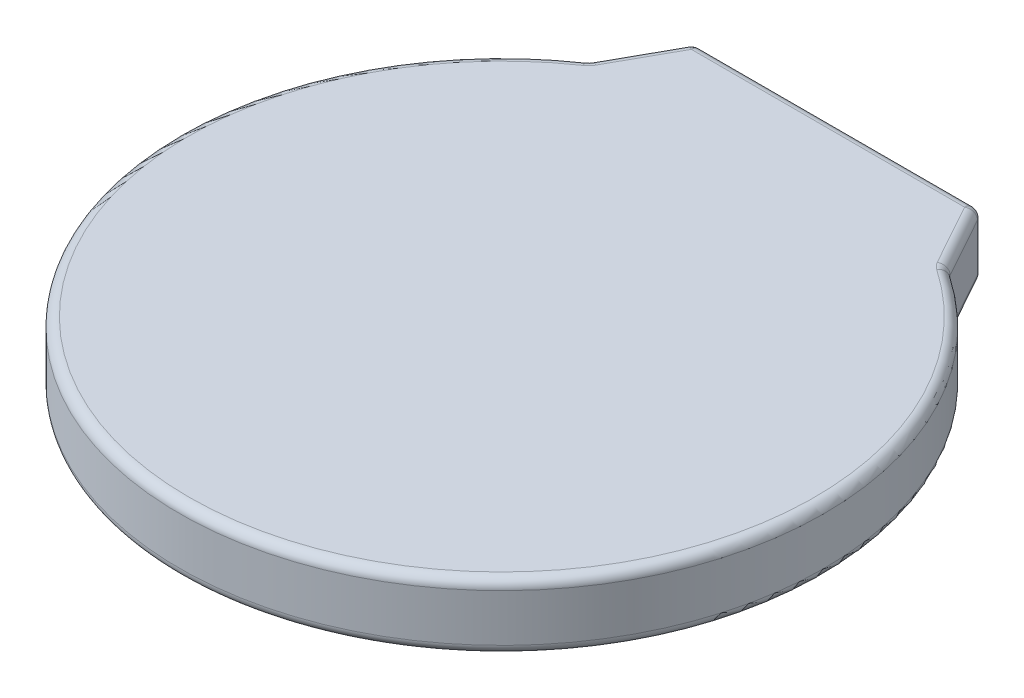
ISO-10303-21;
HEADER;
FILE_DESCRIPTION(('STEP AP214'),'2;1');
FILE_NAME('part.step','',(''),(''),'','','');
FILE_SCHEMA(('AUTOMOTIVE_DESIGN { 1 0 10303 214 1 1 1 1 }'));
ENDSEC;
DATA;
#1=APPLICATION_CONTEXT('core data for automotive mechanical design processes');
#2=APPLICATION_PROTOCOL_DEFINITION('international standard','automotive_design',2000,#1);
#3=PRODUCT_CONTEXT('',#1,'mechanical');
#4=PRODUCT('Part','Part','',(#3));
#5=PRODUCT_RELATED_PRODUCT_CATEGORY('part','',(#4));
#6=PRODUCT_DEFINITION_FORMATION('','',#4);
#7=PRODUCT_DEFINITION_CONTEXT('part definition',#1,'design');
#8=PRODUCT_DEFINITION('design','',#6,#7);
#9=PRODUCT_DEFINITION_SHAPE('','',#8);
#10=(LENGTH_UNIT() NAMED_UNIT(*) SI_UNIT(.MILLI.,.METRE.));
#11=(NAMED_UNIT(*) PLANE_ANGLE_UNIT() SI_UNIT($,.RADIAN.));
#12=(NAMED_UNIT(*) SI_UNIT($,.STERADIAN.) SOLID_ANGLE_UNIT());
#13=UNCERTAINTY_MEASURE_WITH_UNIT(LENGTH_MEASURE(1.E-05),#10,'distance_accuracy_value','');
#14=(GEOMETRIC_REPRESENTATION_CONTEXT(3) GLOBAL_UNCERTAINTY_ASSIGNED_CONTEXT((#13)) GLOBAL_UNIT_ASSIGNED_CONTEXT((#10,
#11,#12)) REPRESENTATION_CONTEXT('',''));
#15=CARTESIAN_POINT('',(0.,0.,0.));
#16=DIRECTION('',(0.,0.,1.));
#17=DIRECTION('',(1.,0.,0.));
#18=AXIS2_PLACEMENT_3D('',#15,#16,#17);
#19=CARTESIAN_POINT('',(0.,3.5,0.));
#20=DIRECTION('',(0.,-1.,0.));
#21=DIRECTION('',(0.,0.,-1.));
#22=AXIS2_PLACEMENT_3D('',#19,#20,#21);
#23=CYLINDRICAL_SURFACE('',#22,17.);
#24=CARTESIAN_POINT('',(0.,3.,0.));
#25=DIRECTION('',(0.,1.,0.));
#26=DIRECTION('',(0.,0.,1.));
#27=AXIS2_PLACEMENT_3D('',#24,#25,#26);
#28=CIRCLE('',#27,17.);
#29=CARTESIAN_POINT('',(9.59708137895813,3.,-14.0319645454817));
#30=VERTEX_POINT('',#29);
#31=CARTESIAN_POINT('',(-9.59708137895813,3.,-14.0319645454817));
#32=VERTEX_POINT('',#31);
#33=EDGE_CURVE('E42',#30,#32,#28,.F.);
#34=ORIENTED_EDGE('',*,*,#33,.T.);
#35=DIRECTION('',(0.,-1.,0.));
#36=VECTOR('',#35,1.);
#37=CARTESIAN_POINT('',(-9.59708137895813,3.5,-14.0319645454817));
#38=LINE('',#37,#36);
#39=CARTESIAN_POINT('',(-9.59708137895813,0.5,-14.0319645454817));
#40=VERTEX_POINT('',#39);
#41=EDGE_CURVE('E11',#32,#40,#38,.T.);
#42=ORIENTED_EDGE('',*,*,#41,.T.);
#43=CARTESIAN_POINT('',(0.,0.5,0.));
#44=DIRECTION('',(0.,1.,0.));
#45=DIRECTION('',(0.,0.,1.));
#46=AXIS2_PLACEMENT_3D('',#43,#44,#45);
#47=CIRCLE('',#46,17.);
#48=CARTESIAN_POINT('',(9.59708137895813,0.5,-14.0319645454817));
#49=VERTEX_POINT('',#48);
#50=EDGE_CURVE('E221',#40,#49,#47,.T.);
#51=ORIENTED_EDGE('',*,*,#50,.T.);
#52=DIRECTION('',(0.,-1.,0.));
#53=VECTOR('',#52,1.);
#54=CARTESIAN_POINT('',(9.59708137895813,3.5,-14.0319645454817));
#55=LINE('',#54,#53);
#56=EDGE_CURVE('E53',#49,#30,#55,.F.);
#57=ORIENTED_EDGE('',*,*,#56,.T.);
#58=EDGE_LOOP('',(#34,#42,#51,#57));
#59=FACE_BOUND('',#58,.T.);
#60=ADVANCED_FACE('F33',(#59),#23,.T.);
#61=CARTESIAN_POINT('',(13.2445336566168,3.5,-7.35372775091861));
#62=DIRECTION('',(0.87427905219483,0.,-0.485423669481937));
#63=DIRECTION('',(-0.485423669481937,0.,-0.87427905219483));
#64=AXIS2_PLACEMENT_3D('',#61,#62,#63);
#65=PLANE('',#64);
#66=DIRECTION('',(0.485423669481937,0.,0.87427905219483));
#67=VECTOR('',#66,1.);
#68=CARTESIAN_POINT('',(7.5,0.5,-17.7));
#69=LINE('',#68,#67);
#70=CARTESIAN_POINT('',(9.44220895224183,0.5,-14.2019575503137));
#71=VERTEX_POINT('',#70);
#72=CARTESIAN_POINT('',(7.64285343447356,0.5,-17.442711834741));
#73=VERTEX_POINT('',#72);
#74=EDGE_CURVE('E306',#71,#73,#69,.F.);
#75=ORIENTED_EDGE('',*,*,#74,.T.);
#76=DIRECTION('',(0.,-1.,0.));
#77=VECTOR('',#76,1.);
#78=CARTESIAN_POINT('',(7.64285343447355,3.5,-17.442711834741));
#79=LINE('',#78,#77);
#80=CARTESIAN_POINT('',(7.64285343447356,3.,-17.442711834741));
#81=VERTEX_POINT('',#80);
#82=EDGE_CURVE('E210',#73,#81,#79,.F.);
#83=ORIENTED_EDGE('',*,*,#82,.T.);
#84=DIRECTION('',(0.485423669481937,0.,0.87427905219483));
#85=VECTOR('',#84,1.);
#86=CARTESIAN_POINT('',(13.2445336566168,3.,-7.35372775091861));
#87=LINE('',#86,#85);
#88=CARTESIAN_POINT('',(9.44220895224183,3.,-14.2019575503137));
#89=VERTEX_POINT('',#88);
#90=EDGE_CURVE('E214',#81,#89,#87,.T.);
#91=ORIENTED_EDGE('',*,*,#90,.T.);
#92=DIRECTION('',(0.,-1.,0.));
#93=VECTOR('',#92,1.);
#94=CARTESIAN_POINT('',(9.44220895224183,3.5,-14.2019575503137));
#95=LINE('',#94,#93);
#96=EDGE_CURVE('E304',#89,#71,#95,.T.);
#97=ORIENTED_EDGE('',*,*,#96,.T.);
#98=EDGE_LOOP('',(#75,#83,#91,#97));
#99=FACE_BOUND('',#98,.T.);
#100=ADVANCED_FACE('F309',(#99),#65,.T.);
#101=CARTESIAN_POINT('',(0.,3.5,-17.7));
#102=DIRECTION('',(0.,0.,-1.));
#103=DIRECTION('',(-1.,0.,0.));
#104=AXIS2_PLACEMENT_3D('',#101,#102,#103);
#105=PLANE('',#104);
#106=DIRECTION('',(1.,0.,0.));
#107=VECTOR('',#106,1.);
#108=CARTESIAN_POINT('',(0.,3.,-17.7));
#109=LINE('',#108,#107);
#110=CARTESIAN_POINT('',(-7.20571390837614,3.,-17.7));
#111=VERTEX_POINT('',#110);
#112=CARTESIAN_POINT('',(7.20571390837614,3.,-17.7));
#113=VERTEX_POINT('',#112);
#114=EDGE_CURVE('E212',#111,#113,#109,.T.);
#115=ORIENTED_EDGE('',*,*,#114,.T.);
#116=DIRECTION('',(0.,-1.,0.));
#117=VECTOR('',#116,1.);
#118=CARTESIAN_POINT('',(7.20571390837614,3.5,-17.7));
#119=LINE('',#118,#117);
#120=CARTESIAN_POINT('',(7.20571390837614,0.5,-17.7));
#121=VERTEX_POINT('',#120);
#122=EDGE_CURVE('E219',#113,#121,#119,.T.);
#123=ORIENTED_EDGE('',*,*,#122,.T.);
#124=DIRECTION('',(1.,0.,0.));
#125=VECTOR('',#124,1.);
#126=CARTESIAN_POINT('',(-7.5,0.5,-17.7));
#127=LINE('',#126,#125);
#128=CARTESIAN_POINT('',(-7.20571390837614,0.5,-17.7));
#129=VERTEX_POINT('',#128);
#130=EDGE_CURVE('E205',#121,#129,#127,.F.);
#131=ORIENTED_EDGE('',*,*,#130,.T.);
#132=DIRECTION('',(0.,-1.,0.));
#133=VECTOR('',#132,1.);
#134=CARTESIAN_POINT('',(-7.20571390837614,3.5,-17.7));
#135=LINE('',#134,#133);
#136=EDGE_CURVE('E209',#129,#111,#135,.F.);
#137=ORIENTED_EDGE('',*,*,#136,.T.);
#138=EDGE_LOOP('',(#115,#123,#131,#137));
#139=FACE_BOUND('',#138,.T.);
#140=ADVANCED_FACE('F352',(#139),#105,.T.);
#141=CARTESIAN_POINT('',(-13.2445336566168,3.5,-7.35372775091862));
#142=DIRECTION('',(0.87427905219483,0.,0.485423669481938));
#143=DIRECTION('',(0.485423669481938,0.,-0.87427905219483));
#144=AXIS2_PLACEMENT_3D('',#141,#142,#143);
#145=PLANE('',#144);
#146=DIRECTION('',(-0.485423669481938,0.,0.87427905219483));
#147=VECTOR('',#146,1.);
#148=CARTESIAN_POINT('',(-7.5,3.,-17.7));
#149=LINE('',#148,#147);
#150=CARTESIAN_POINT('',(-9.44220895224183,3.,-14.2019575503137));
#151=VERTEX_POINT('',#150);
#152=CARTESIAN_POINT('',(-7.64285343447355,3.,-17.442711834741));
#153=VERTEX_POINT('',#152);
#154=EDGE_CURVE('E283',#151,#153,#149,.F.);
#155=ORIENTED_EDGE('',*,*,#154,.T.);
#156=DIRECTION('',(0.,-1.,0.));
#157=VECTOR('',#156,1.);
#158=CARTESIAN_POINT('',(-7.64285343447355,0.,-17.442711834741));
#159=LINE('',#158,#157);
#160=CARTESIAN_POINT('',(-7.64285343447355,0.5,-17.442711834741));
#161=VERTEX_POINT('',#160);
#162=EDGE_CURVE('E286',#153,#161,#159,.T.);
#163=ORIENTED_EDGE('',*,*,#162,.T.);
#164=DIRECTION('',(-0.485423669481938,0.,0.87427905219483));
#165=VECTOR('',#164,1.);
#166=CARTESIAN_POINT('',(-13.2445336566168,0.5,-7.35372775091862));
#167=LINE('',#166,#165);
#168=CARTESIAN_POINT('',(-9.44220895224183,0.5,-14.2019575503137));
#169=VERTEX_POINT('',#168);
#170=EDGE_CURVE('E287',#161,#169,#167,.T.);
#171=ORIENTED_EDGE('',*,*,#170,.T.);
#172=DIRECTION('',(0.,1.,0.));
#173=VECTOR('',#172,1.);
#174=CARTESIAN_POINT('',(-9.44220895224183,3.5,-14.2019575503137));
#175=LINE('',#174,#173);
#176=EDGE_CURVE('E290',#169,#151,#175,.T.);
#177=ORIENTED_EDGE('',*,*,#176,.T.);
#178=EDGE_LOOP('',(#155,#163,#171,#177));
#179=FACE_BOUND('',#178,.T.);
#180=ADVANCED_FACE('F326',(#179),#145,.F.);
#181=CARTESIAN_POINT('',(0.,3.5,0.));
#182=DIRECTION('',(0.,1.,0.));
#183=DIRECTION('',(0.,0.,1.));
#184=AXIS2_PLACEMENT_3D('',#181,#182,#183);
#185=PLANE('',#184);
#186=DIRECTION('',(0.485423669481937,0.,0.87427905219483));
#187=VECTOR('',#186,1.);
#188=CARTESIAN_POINT('',(12.8073941305194,3.5,-7.11101591617764));
#189=LINE('',#188,#187);
#190=CARTESIAN_POINT('',(9.00506942614442,3.5,-13.9592457155727));
#191=VERTEX_POINT('',#190);
#192=CARTESIAN_POINT('',(7.20571390837614,3.5,-17.2));
#193=VERTEX_POINT('',#192);
#194=EDGE_CURVE('E136',#191,#193,#189,.F.);
#195=ORIENTED_EDGE('',*,*,#194,.T.);
#196=DIRECTION('',(1.,0.,0.));
#197=VECTOR('',#196,1.);
#198=CARTESIAN_POINT('',(0.,3.5,-17.2));
#199=LINE('',#198,#197);
#200=CARTESIAN_POINT('',(-7.20571390837614,3.5,-17.2));
#201=VERTEX_POINT('',#200);
#202=EDGE_CURVE('E320',#193,#201,#199,.F.);
#203=ORIENTED_EDGE('',*,*,#202,.T.);
#204=DIRECTION('',(-0.485423669481938,0.,0.87427905219483));
#205=VECTOR('',#204,1.);
#206=CARTESIAN_POINT('',(-9.06286047390259,3.5,-13.8551603451307));
#207=LINE('',#206,#205);
#208=CARTESIAN_POINT('',(-9.00506942614442,3.5,-13.9592457155727));
#209=VERTEX_POINT('',#208);
#210=EDGE_CURVE('E281',#201,#209,#207,.T.);
#211=ORIENTED_EDGE('',*,*,#210,.T.);
#212=CARTESIAN_POINT('',(-9.87934847833925,3.5,-14.4446693850547));
#213=DIRECTION('',(0.,1.,0.));
#214=DIRECTION('',(0.,0.,1.));
#215=AXIS2_PLACEMENT_3D('',#212,#213,#214);
#216=CIRCLE('',#215,1.);
#217=CARTESIAN_POINT('',(-9.31481427957701,3.5,-13.6192597059087));
#218=VERTEX_POINT('',#217);
#219=EDGE_CURVE('E154',#218,#209,#216,.T.);
#220=ORIENTED_EDGE('',*,*,#219,.F.);
#221=CARTESIAN_POINT('',(0.,3.5,0.));
#222=DIRECTION('',(0.,1.,0.));
#223=DIRECTION('',(0.,0.,1.));
#224=AXIS2_PLACEMENT_3D('',#221,#222,#223);
#225=CIRCLE('',#224,16.5);
#226=CARTESIAN_POINT('',(9.31481427957701,3.5,-13.6192597059087));
#227=VERTEX_POINT('',#226);
#228=EDGE_CURVE('E139',#218,#227,#225,.T.);
#229=ORIENTED_EDGE('',*,*,#228,.T.);
#230=CARTESIAN_POINT('',(9.87934847833925,3.5,-14.4446693850547));
#231=DIRECTION('',(0.,1.,0.));
#232=DIRECTION('',(0.,0.,1.));
#233=AXIS2_PLACEMENT_3D('',#230,#231,#232);
#234=CIRCLE('',#233,1.);
#235=EDGE_CURVE('E133',#191,#227,#234,.T.);
#236=ORIENTED_EDGE('',*,*,#235,.F.);
#237=EDGE_LOOP('',(#195,#203,#211,#220,#229,#236));
#238=FACE_BOUND('',#237,.T.);
#239=ADVANCED_FACE('F135',(#238),#185,.T.);
#240=CARTESIAN_POINT('',(0.,0.,0.));
#241=DIRECTION('',(0.,1.,0.));
#242=DIRECTION('',(0.,0.,1.));
#243=AXIS2_PLACEMENT_3D('',#240,#241,#242);
#244=PLANE('',#243);
#245=DIRECTION('',(-0.485423669481938,0.,0.87427905219483));
#246=VECTOR('',#245,1.);
#247=CARTESIAN_POINT('',(-12.8073941305194,0.,-7.11101591617765));
#248=LINE('',#247,#246);
#249=CARTESIAN_POINT('',(-9.00506942614442,0.,-13.9592457155727));
#250=VERTEX_POINT('',#249);
#251=CARTESIAN_POINT('',(-7.20571390837614,0.,-17.2));
#252=VERTEX_POINT('',#251);
#253=EDGE_CURVE('E301',#250,#252,#248,.F.);
#254=ORIENTED_EDGE('',*,*,#253,.T.);
#255=DIRECTION('',(1.,0.,0.));
#256=VECTOR('',#255,1.);
#257=CARTESIAN_POINT('',(7.5,0.,-17.2));
#258=LINE('',#257,#256);
#259=CARTESIAN_POINT('',(7.20571390837614,0.,-17.2));
#260=VERTEX_POINT('',#259);
#261=EDGE_CURVE('E203',#252,#260,#258,.T.);
#262=ORIENTED_EDGE('',*,*,#261,.T.);
#263=DIRECTION('',(0.485423669481937,0.,0.87427905219483));
#264=VECTOR('',#263,1.);
#265=CARTESIAN_POINT('',(9.06286047390259,0.,-13.8551603451307));
#266=LINE('',#265,#264);
#267=CARTESIAN_POINT('',(9.00506942614442,0.,-13.9592457155727));
#268=VERTEX_POINT('',#267);
#269=EDGE_CURVE('E299',#260,#268,#266,.T.);
#270=ORIENTED_EDGE('',*,*,#269,.T.);
#271=CARTESIAN_POINT('',(9.87934847833925,0.,-14.4446693850547));
#272=DIRECTION('',(0.,1.,0.));
#273=DIRECTION('',(0.,0.,1.));
#274=AXIS2_PLACEMENT_3D('',#271,#272,#273);
#275=CIRCLE('',#274,1.);
#276=CARTESIAN_POINT('',(9.31481427957701,0.,-13.6192597059087));
#277=VERTEX_POINT('',#276);
#278=EDGE_CURVE('E297',#277,#268,#275,.F.);
#279=ORIENTED_EDGE('',*,*,#278,.F.);
#280=CARTESIAN_POINT('',(0.,0.,0.));
#281=DIRECTION('',(0.,1.,0.));
#282=DIRECTION('',(0.,0.,1.));
#283=AXIS2_PLACEMENT_3D('',#280,#281,#282);
#284=CIRCLE('',#283,16.5);
#285=CARTESIAN_POINT('',(-9.31481427957701,0.,-13.6192597059087));
#286=VERTEX_POINT('',#285);
#287=EDGE_CURVE('E295',#277,#286,#284,.F.);
#288=ORIENTED_EDGE('',*,*,#287,.T.);
#289=CARTESIAN_POINT('',(-9.87934847833925,0.,-14.4446693850547));
#290=DIRECTION('',(0.,1.,0.));
#291=DIRECTION('',(0.,0.,1.));
#292=AXIS2_PLACEMENT_3D('',#289,#290,#291);
#293=CIRCLE('',#292,1.);
#294=EDGE_CURVE('E261',#250,#286,#293,.F.);
#295=ORIENTED_EDGE('',*,*,#294,.F.);
#296=EDGE_LOOP('',(#254,#262,#270,#279,#288,#295));
#297=FACE_BOUND('',#296,.T.);
#298=ADVANCED_FACE('F335',(#297),#244,.F.);
#299=CARTESIAN_POINT('',(12.8073941305194,0.5,-7.11101591617764));
#300=DIRECTION('',(-0.485423669481937,0.,-0.87427905219483));
#301=DIRECTION('',(-0.87427905219483,0.,0.485423669481937));
#302=AXIS2_PLACEMENT_3D('',#299,#300,#301);
#303=CYLINDRICAL_SURFACE('',#302,0.5);
#304=CARTESIAN_POINT('',(7.20571390837614,0.5,-17.2));
#305=DIRECTION('',(-0.48542366948194,0.,-0.874279052194829));
#306=DIRECTION('',(-0.874279052194829,0.,0.48542366948194));
#307=AXIS2_PLACEMENT_3D('',#304,#305,#306);
#308=CIRCLE('',#307,0.5);
#309=EDGE_CURVE('E37',#73,#260,#308,.T.);
#310=ORIENTED_EDGE('',*,*,#309,.F.);
#311=ORIENTED_EDGE('',*,*,#74,.F.);
#312=CARTESIAN_POINT('',(9.00506942614442,0.5,-13.9592457155727));
#313=DIRECTION('',(0.485423669481936,0.,0.874279052194831));
#314=DIRECTION('',(0.874279052194831,0.,-0.485423669481936));
#315=AXIS2_PLACEMENT_3D('',#312,#313,#314);
#316=CIRCLE('',#315,0.5);
#317=EDGE_CURVE('E183',#268,#71,#316,.T.);
#318=ORIENTED_EDGE('',*,*,#317,.F.);
#319=ORIENTED_EDGE('',*,*,#269,.F.);
#320=EDGE_LOOP('',(#310,#311,#318,#319));
#321=FACE_BOUND('',#320,.T.);
#322=ADVANCED_FACE('F35',(#321),#303,.T.);
#323=CARTESIAN_POINT('',(7.20571390837614,0.5,-17.2));
#324=DIRECTION('',(0.,0.,1.));
#325=DIRECTION('',(1.,0.,0.));
#326=AXIS2_PLACEMENT_3D('',#323,#324,#325);
#327=SPHERICAL_SURFACE('',#326,0.5);
#328=CARTESIAN_POINT('',(7.20571390837614,0.5,-17.2));
#329=DIRECTION('',(0.,-1.,0.));
#330=DIRECTION('',(0.,0.,-1.));
#331=AXIS2_PLACEMENT_3D('',#328,#329,#330);
#332=CIRCLE('',#331,0.5);
#333=EDGE_CURVE('E178',#73,#121,#332,.F.);
#334=ORIENTED_EDGE('',*,*,#333,.F.);
#335=ORIENTED_EDGE('',*,*,#309,.T.);
#336=CARTESIAN_POINT('',(7.20571390837614,0.5,-17.2));
#337=DIRECTION('',(1.,0.,0.));
#338=DIRECTION('',(0.,0.,-1.));
#339=AXIS2_PLACEMENT_3D('',#336,#337,#338);
#340=CIRCLE('',#339,0.5);
#341=EDGE_CURVE('E181',#121,#260,#340,.F.);
#342=ORIENTED_EDGE('',*,*,#341,.F.);
#343=EDGE_LOOP('',(#334,#335,#342));
#344=FACE_BOUND('',#343,.T.);
#345=ADVANCED_FACE('F194',(#344),#327,.T.);
#346=CARTESIAN_POINT('',(9.87934847833925,0.5,-14.4446693850547));
#347=DIRECTION('',(0.,1.,0.));
#348=DIRECTION('',(0.,0.,1.));
#349=AXIS2_PLACEMENT_3D('',#346,#347,#348);
#350=TOROIDAL_SURFACE('',#349,1.,0.5);
#351=ORIENTED_EDGE('',*,*,#278,.T.);
#352=ORIENTED_EDGE('',*,*,#317,.T.);
#353=CARTESIAN_POINT('',(9.87934847833925,0.5,-14.4446693850547));
#354=DIRECTION('',(0.,1.,0.));
#355=DIRECTION('',(0.,0.,1.));
#356=AXIS2_PLACEMENT_3D('',#353,#354,#355);
#357=CIRCLE('',#356,0.5);
#358=EDGE_CURVE('E175',#49,#71,#357,.F.);
#359=ORIENTED_EDGE('',*,*,#358,.F.);
#360=CARTESIAN_POINT('',(9.31481427957701,0.5,-13.6192597059087));
#361=DIRECTION('',(-0.825409679145983,0.,-0.564534198762242));
#362=DIRECTION('',(-0.564534198762242,0.,0.825409679145983));
#363=AXIS2_PLACEMENT_3D('',#360,#361,#362);
#364=CIRCLE('',#363,0.5);
#365=EDGE_CURVE('E172',#277,#49,#364,.F.);
#366=ORIENTED_EDGE('',*,*,#365,.F.);
#367=EDGE_LOOP('',(#351,#352,#359,#366));
#368=FACE_BOUND('',#367,.T.);
#369=ADVANCED_FACE('F336',(#368),#350,.T.);
#370=CARTESIAN_POINT('',(0.,0.5,-17.2));
#371=DIRECTION('',(-1.,0.,0.));
#372=DIRECTION('',(0.,0.,1.));
#373=AXIS2_PLACEMENT_3D('',#370,#371,#372);
#374=CYLINDRICAL_SURFACE('',#373,0.5);
#375=ORIENTED_EDGE('',*,*,#341,.T.);
#376=ORIENTED_EDGE('',*,*,#261,.F.);
#377=CARTESIAN_POINT('',(-7.20571390837614,0.5,-17.2));
#378=DIRECTION('',(-1.,0.,0.));
#379=DIRECTION('',(0.,-1.,0.));
#380=AXIS2_PLACEMENT_3D('',#377,#378,#379);
#381=CIRCLE('',#380,0.5);
#382=EDGE_CURVE('E167',#129,#252,#381,.T.);
#383=ORIENTED_EDGE('',*,*,#382,.F.);
#384=ORIENTED_EDGE('',*,*,#130,.F.);
#385=EDGE_LOOP('',(#375,#376,#383,#384));
#386=FACE_BOUND('',#385,.T.);
#387=ADVANCED_FACE('F201',(#386),#374,.T.);
#388=CARTESIAN_POINT('',(7.20571390837614,3.5,-17.2));
#389=DIRECTION('',(0.,-1.,0.));
#390=DIRECTION('',(0.,0.,-1.));
#391=AXIS2_PLACEMENT_3D('',#388,#389,#390);
#392=CYLINDRICAL_SURFACE('',#391,0.5);
#393=ORIENTED_EDGE('',*,*,#333,.T.);
#394=ORIENTED_EDGE('',*,*,#122,.F.);
#395=CARTESIAN_POINT('',(7.20571390837614,3.,-17.2));
#396=DIRECTION('',(0.,1.,0.));
#397=DIRECTION('',(0.,0.,1.));
#398=AXIS2_PLACEMENT_3D('',#395,#396,#397);
#399=CIRCLE('',#398,0.5);
#400=EDGE_CURVE('E159',#81,#113,#399,.T.);
#401=ORIENTED_EDGE('',*,*,#400,.F.);
#402=ORIENTED_EDGE('',*,*,#82,.F.);
#403=EDGE_LOOP('',(#393,#394,#401,#402));
#404=FACE_BOUND('',#403,.T.);
#405=ADVANCED_FACE('F313',(#404),#392,.T.);
#406=CARTESIAN_POINT('',(12.8073941305194,3.,-7.11101591617764));
#407=DIRECTION('',(0.485423669481937,0.,0.87427905219483));
#408=DIRECTION('',(0.87427905219483,0.,-0.485423669481937));
#409=AXIS2_PLACEMENT_3D('',#406,#407,#408);
#410=CYLINDRICAL_SURFACE('',#409,0.5);
#411=CARTESIAN_POINT('',(9.00506942614442,3.,-13.9592457155727));
#412=DIRECTION('',(0.485423669481937,0.,0.87427905219483));
#413=DIRECTION('',(0.87427905219483,0.,-0.485423669481937));
#414=AXIS2_PLACEMENT_3D('',#411,#412,#413);
#415=CIRCLE('',#414,0.5);
#416=EDGE_CURVE('E149',#89,#191,#415,.T.);
#417=ORIENTED_EDGE('',*,*,#416,.F.);
#418=ORIENTED_EDGE('',*,*,#90,.F.);
#419=CARTESIAN_POINT('',(7.20571390837614,3.,-17.2));
#420=DIRECTION('',(-0.485423669481933,0.,-0.874279052194833));
#421=DIRECTION('',(-0.874279052194833,0.,0.485423669481933));
#422=AXIS2_PLACEMENT_3D('',#419,#420,#421);
#423=CIRCLE('',#422,0.5);
#424=EDGE_CURVE('E152',#193,#81,#423,.T.);
#425=ORIENTED_EDGE('',*,*,#424,.F.);
#426=ORIENTED_EDGE('',*,*,#194,.F.);
#427=EDGE_LOOP('',(#417,#418,#425,#426));
#428=FACE_BOUND('',#427,.T.);
#429=ADVANCED_FACE('F147',(#428),#410,.T.);
#430=CARTESIAN_POINT('',(9.87934847833925,3.5,-14.4446693850547));
#431=DIRECTION('',(0.,-1.,0.));
#432=DIRECTION('',(0.,0.,-1.));
#433=AXIS2_PLACEMENT_3D('',#430,#431,#432);
#434=CYLINDRICAL_SURFACE('',#433,0.5);
#435=ORIENTED_EDGE('',*,*,#358,.T.);
#436=ORIENTED_EDGE('',*,*,#96,.F.);
#437=CARTESIAN_POINT('',(9.87934847833925,3.,-14.4446693850547));
#438=DIRECTION('',(0.,1.,0.));
#439=DIRECTION('',(0.,0.,1.));
#440=AXIS2_PLACEMENT_3D('',#437,#438,#439);
#441=CIRCLE('',#440,0.5);
#442=EDGE_CURVE('E157',#30,#89,#441,.F.);
#443=ORIENTED_EDGE('',*,*,#442,.F.);
#444=ORIENTED_EDGE('',*,*,#56,.F.);
#445=EDGE_LOOP('',(#435,#436,#443,#444));
#446=FACE_BOUND('',#445,.T.);
#447=ADVANCED_FACE('F338',(#446),#434,.F.);
#448=CARTESIAN_POINT('',(0.,0.5,0.));
#449=DIRECTION('',(0.,1.,0.));
#450=DIRECTION('',(0.,0.,1.));
#451=AXIS2_PLACEMENT_3D('',#448,#449,#450);
#452=TOROIDAL_SURFACE('',#451,16.5,0.5);
#453=ORIENTED_EDGE('',*,*,#365,.T.);
#454=ORIENTED_EDGE('',*,*,#50,.F.);
#455=CARTESIAN_POINT('',(-9.31481427957701,0.5,-13.6192597059087));
#456=DIRECTION('',(0.825409679145983,0.,-0.564534198762241));
#457=DIRECTION('',(-0.564534198762241,0.,-0.825409679145983));
#458=AXIS2_PLACEMENT_3D('',#455,#456,#457);
#459=CIRCLE('',#458,0.5);
#460=EDGE_CURVE('E161',#286,#40,#459,.T.);
#461=ORIENTED_EDGE('',*,*,#460,.F.);
#462=ORIENTED_EDGE('',*,*,#287,.F.);
#463=EDGE_LOOP('',(#453,#454,#461,#462));
#464=FACE_BOUND('',#463,.T.);
#465=ADVANCED_FACE('F264',(#464),#452,.T.);
#466=CARTESIAN_POINT('',(-12.8073941305194,0.5,-7.11101591617765));
#467=DIRECTION('',(-0.485423669481938,0.,0.87427905219483));
#468=DIRECTION('',(0.87427905219483,0.,0.485423669481938));
#469=AXIS2_PLACEMENT_3D('',#466,#467,#468);
#470=CYLINDRICAL_SURFACE('',#469,0.5);
#471=CARTESIAN_POINT('',(-7.20571390837614,0.5,-17.2));
#472=DIRECTION('',(0.48542366948194,0.,-0.874279052194829));
#473=DIRECTION('',(-0.874279052194829,0.,-0.48542366948194));
#474=AXIS2_PLACEMENT_3D('',#471,#472,#473);
#475=CIRCLE('',#474,0.5);
#476=EDGE_CURVE('E169',#252,#161,#475,.T.);
#477=ORIENTED_EDGE('',*,*,#476,.F.);
#478=ORIENTED_EDGE('',*,*,#253,.F.);
#479=CARTESIAN_POINT('',(-9.00506942614442,0.5,-13.9592457155727));
#480=DIRECTION('',(-0.485423669481937,0.,0.87427905219483));
#481=DIRECTION('',(0.87427905219483,0.,0.485423669481937));
#482=AXIS2_PLACEMENT_3D('',#479,#480,#481);
#483=CIRCLE('',#482,0.5);
#484=EDGE_CURVE('E251',#169,#250,#483,.T.);
#485=ORIENTED_EDGE('',*,*,#484,.F.);
#486=ORIENTED_EDGE('',*,*,#170,.F.);
#487=EDGE_LOOP('',(#477,#478,#485,#486));
#488=FACE_BOUND('',#487,.T.);
#489=ADVANCED_FACE('F333',(#488),#470,.T.);
#490=CARTESIAN_POINT('',(-7.20571390837614,0.5,-17.2));
#491=DIRECTION('',(0.,0.,1.));
#492=DIRECTION('',(1.,0.,0.));
#493=AXIS2_PLACEMENT_3D('',#490,#491,#492);
#494=SPHERICAL_SURFACE('',#493,0.5);
#495=ORIENTED_EDGE('',*,*,#382,.T.);
#496=ORIENTED_EDGE('',*,*,#476,.T.);
#497=CARTESIAN_POINT('',(-7.20571390837614,0.5,-17.2));
#498=DIRECTION('',(0.,-1.,0.));
#499=DIRECTION('',(0.,0.,-1.));
#500=AXIS2_PLACEMENT_3D('',#497,#498,#499);
#501=CIRCLE('',#500,0.5);
#502=EDGE_CURVE('E248',#129,#161,#501,.F.);
#503=ORIENTED_EDGE('',*,*,#502,.F.);
#504=EDGE_LOOP('',(#495,#496,#503));
#505=FACE_BOUND('',#504,.T.);
#506=ADVANCED_FACE('F380',(#505),#494,.T.);
#507=CARTESIAN_POINT('',(7.20571390837614,3.,-17.2));
#508=DIRECTION('',(0.,0.,1.));
#509=DIRECTION('',(1.,0.,0.));
#510=AXIS2_PLACEMENT_3D('',#507,#508,#509);
#511=SPHERICAL_SURFACE('',#510,0.5);
#512=ORIENTED_EDGE('',*,*,#424,.T.);
#513=ORIENTED_EDGE('',*,*,#400,.T.);
#514=CARTESIAN_POINT('',(7.20571390837614,3.,-17.2));
#515=DIRECTION('',(1.,0.,0.));
#516=DIRECTION('',(0.,1.,0.));
#517=AXIS2_PLACEMENT_3D('',#514,#515,#516);
#518=CIRCLE('',#517,0.5);
#519=EDGE_CURVE('E245',#193,#113,#518,.F.);
#520=ORIENTED_EDGE('',*,*,#519,.F.);
#521=EDGE_LOOP('',(#512,#513,#520));
#522=FACE_BOUND('',#521,.T.);
#523=ADVANCED_FACE('F315',(#522),#511,.T.);
#524=CARTESIAN_POINT('',(9.87934847833925,3.,-14.4446693850547));
#525=DIRECTION('',(0.,1.,0.));
#526=DIRECTION('',(0.,0.,1.));
#527=AXIS2_PLACEMENT_3D('',#524,#525,#526);
#528=TOROIDAL_SURFACE('',#527,1.,0.5);
#529=ORIENTED_EDGE('',*,*,#416,.T.);
#530=ORIENTED_EDGE('',*,*,#235,.T.);
#531=CARTESIAN_POINT('',(9.31481427957701,3.,-13.6192597059087));
#532=DIRECTION('',(-0.825409679145983,0.,-0.564534198762242));
#533=DIRECTION('',(-0.564534198762242,0.,0.825409679145983));
#534=AXIS2_PLACEMENT_3D('',#531,#532,#533);
#535=CIRCLE('',#534,0.5);
#536=EDGE_CURVE('E243',#30,#227,#535,.F.);
#537=ORIENTED_EDGE('',*,*,#536,.F.);
#538=ORIENTED_EDGE('',*,*,#442,.T.);
#539=EDGE_LOOP('',(#529,#530,#537,#538));
#540=FACE_BOUND('',#539,.T.);
#541=ADVANCED_FACE('F156',(#540),#528,.T.);
#542=CARTESIAN_POINT('',(-9.87934847833925,0.5,-14.4446693850547));
#543=DIRECTION('',(0.,1.,0.));
#544=DIRECTION('',(0.,0.,1.));
#545=AXIS2_PLACEMENT_3D('',#542,#543,#544);
#546=TOROIDAL_SURFACE('',#545,1.,0.5);
#547=ORIENTED_EDGE('',*,*,#294,.T.);
#548=ORIENTED_EDGE('',*,*,#460,.T.);
#549=CARTESIAN_POINT('',(-9.87934847833925,0.5,-14.4446693850547));
#550=DIRECTION('',(0.,1.,0.));
#551=DIRECTION('',(0.,0.,1.));
#552=AXIS2_PLACEMENT_3D('',#549,#550,#551);
#553=CIRCLE('',#552,0.5);
#554=EDGE_CURVE('E241',#169,#40,#553,.F.);
#555=ORIENTED_EDGE('',*,*,#554,.F.);
#556=ORIENTED_EDGE('',*,*,#484,.T.);
#557=EDGE_LOOP('',(#547,#548,#555,#556));
#558=FACE_BOUND('',#557,.T.);
#559=ADVANCED_FACE('F259',(#558),#546,.T.);
#560=CARTESIAN_POINT('',(-7.20571390837614,3.5,-17.2));
#561=DIRECTION('',(0.,1.,0.));
#562=DIRECTION('',(0.,0.,1.));
#563=AXIS2_PLACEMENT_3D('',#560,#561,#562);
#564=CYLINDRICAL_SURFACE('',#563,0.5);
#565=ORIENTED_EDGE('',*,*,#502,.T.);
#566=ORIENTED_EDGE('',*,*,#162,.F.);
#567=CARTESIAN_POINT('',(-7.20571390837614,3.,-17.2));
#568=DIRECTION('',(0.,1.,0.));
#569=DIRECTION('',(0.,0.,1.));
#570=AXIS2_PLACEMENT_3D('',#567,#568,#569);
#571=CIRCLE('',#570,0.5);
#572=EDGE_CURVE('E238',#111,#153,#571,.T.);
#573=ORIENTED_EDGE('',*,*,#572,.F.);
#574=ORIENTED_EDGE('',*,*,#136,.F.);
#575=EDGE_LOOP('',(#565,#566,#573,#574));
#576=FACE_BOUND('',#575,.T.);
#577=ADVANCED_FACE('F370',(#576),#564,.T.);
#578=CARTESIAN_POINT('',(0.,3.,-17.2));
#579=DIRECTION('',(1.,0.,0.));
#580=DIRECTION('',(0.,0.,-1.));
#581=AXIS2_PLACEMENT_3D('',#578,#579,#580);
#582=CYLINDRICAL_SURFACE('',#581,0.5);
#583=ORIENTED_EDGE('',*,*,#519,.T.);
#584=ORIENTED_EDGE('',*,*,#114,.F.);
#585=CARTESIAN_POINT('',(-7.20571390837614,3.,-17.2));
#586=DIRECTION('',(-1.,0.,0.));
#587=DIRECTION('',(0.,0.,1.));
#588=AXIS2_PLACEMENT_3D('',#585,#586,#587);
#589=CIRCLE('',#588,0.5);
#590=EDGE_CURVE('E235',#201,#111,#589,.T.);
#591=ORIENTED_EDGE('',*,*,#590,.F.);
#592=ORIENTED_EDGE('',*,*,#202,.F.);
#593=EDGE_LOOP('',(#583,#584,#591,#592));
#594=FACE_BOUND('',#593,.T.);
#595=ADVANCED_FACE('F321',(#594),#582,.T.);
#596=CARTESIAN_POINT('',(0.,3.,0.));
#597=DIRECTION('',(0.,1.,0.));
#598=DIRECTION('',(0.,0.,1.));
#599=AXIS2_PLACEMENT_3D('',#596,#597,#598);
#600=TOROIDAL_SURFACE('',#599,16.5,0.5);
#601=ORIENTED_EDGE('',*,*,#536,.T.);
#602=ORIENTED_EDGE('',*,*,#228,.F.);
#603=CARTESIAN_POINT('',(-9.31481427957701,3.,-13.6192597059087));
#604=DIRECTION('',(0.825409679145983,0.,-0.564534198762242));
#605=DIRECTION('',(-0.564534198762242,0.,-0.825409679145983));
#606=AXIS2_PLACEMENT_3D('',#603,#604,#605);
#607=CIRCLE('',#606,0.5);
#608=EDGE_CURVE('E232',#32,#218,#607,.T.);
#609=ORIENTED_EDGE('',*,*,#608,.F.);
#610=ORIENTED_EDGE('',*,*,#33,.F.);
#611=EDGE_LOOP('',(#601,#602,#609,#610));
#612=FACE_BOUND('',#611,.T.);
#613=ADVANCED_FACE('F272',(#612),#600,.T.);
#614=CARTESIAN_POINT('',(-9.87934847833925,3.5,-14.4446693850547));
#615=DIRECTION('',(0.,-1.,0.));
#616=DIRECTION('',(0.,0.,-1.));
#617=AXIS2_PLACEMENT_3D('',#614,#615,#616);
#618=CYLINDRICAL_SURFACE('',#617,0.5);
#619=ORIENTED_EDGE('',*,*,#554,.T.);
#620=ORIENTED_EDGE('',*,*,#41,.F.);
#621=CARTESIAN_POINT('',(-9.87934847833925,3.,-14.4446693850547));
#622=DIRECTION('',(0.,1.,0.));
#623=DIRECTION('',(0.,0.,1.));
#624=AXIS2_PLACEMENT_3D('',#621,#622,#623);
#625=CIRCLE('',#624,0.5);
#626=EDGE_CURVE('E229',#151,#32,#625,.F.);
#627=ORIENTED_EDGE('',*,*,#626,.F.);
#628=ORIENTED_EDGE('',*,*,#176,.F.);
#629=EDGE_LOOP('',(#619,#620,#627,#628));
#630=FACE_BOUND('',#629,.T.);
#631=ADVANCED_FACE('F269',(#630),#618,.F.);
#632=CARTESIAN_POINT('',(-7.20571390837614,3.,-17.2));
#633=DIRECTION('',(0.,0.,1.));
#634=DIRECTION('',(1.,0.,0.));
#635=AXIS2_PLACEMENT_3D('',#632,#633,#634);
#636=SPHERICAL_SURFACE('',#635,0.5);
#637=ORIENTED_EDGE('',*,*,#590,.T.);
#638=ORIENTED_EDGE('',*,*,#572,.T.);
#639=CARTESIAN_POINT('',(-7.20571390837614,3.,-17.2));
#640=DIRECTION('',(0.48542366948194,0.,-0.874279052194829));
#641=DIRECTION('',(-0.874279052194829,0.,-0.48542366948194));
#642=AXIS2_PLACEMENT_3D('',#639,#640,#641);
#643=CIRCLE('',#642,0.5);
#644=EDGE_CURVE('E227',#201,#153,#643,.F.);
#645=ORIENTED_EDGE('',*,*,#644,.F.);
#646=EDGE_LOOP('',(#637,#638,#645));
#647=FACE_BOUND('',#646,.T.);
#648=ADVANCED_FACE('F360',(#647),#636,.T.);
#649=CARTESIAN_POINT('',(-9.87934847833925,3.,-14.4446693850547));
#650=DIRECTION('',(0.,1.,0.));
#651=DIRECTION('',(0.,0.,1.));
#652=AXIS2_PLACEMENT_3D('',#649,#650,#651);
#653=TOROIDAL_SURFACE('',#652,1.,0.5);
#654=ORIENTED_EDGE('',*,*,#608,.T.);
#655=ORIENTED_EDGE('',*,*,#219,.T.);
#656=CARTESIAN_POINT('',(-9.00506942614442,3.,-13.9592457155727));
#657=DIRECTION('',(-0.485423669481936,0.,0.874279052194831));
#658=DIRECTION('',(0.874279052194831,0.,0.485423669481936));
#659=AXIS2_PLACEMENT_3D('',#656,#657,#658);
#660=CIRCLE('',#659,0.5);
#661=EDGE_CURVE('E225',#151,#209,#660,.F.);
#662=ORIENTED_EDGE('',*,*,#661,.F.);
#663=ORIENTED_EDGE('',*,*,#626,.T.);
#664=EDGE_LOOP('',(#654,#655,#662,#663));
#665=FACE_BOUND('',#664,.T.);
#666=ADVANCED_FACE('F276',(#665),#653,.T.);
#667=CARTESIAN_POINT('',(-12.8073941305194,3.,-7.11101591617765));
#668=DIRECTION('',(0.485423669481938,0.,-0.87427905219483));
#669=DIRECTION('',(-0.87427905219483,0.,-0.485423669481938));
#670=AXIS2_PLACEMENT_3D('',#667,#668,#669);
#671=CYLINDRICAL_SURFACE('',#670,0.5);
#672=ORIENTED_EDGE('',*,*,#644,.T.);
#673=ORIENTED_EDGE('',*,*,#154,.F.);
#674=ORIENTED_EDGE('',*,*,#661,.T.);
#675=ORIENTED_EDGE('',*,*,#210,.F.);
#676=EDGE_LOOP('',(#672,#673,#674,#675));
#677=FACE_BOUND('',#676,.T.);
#678=ADVANCED_FACE('F280',(#677),#671,.T.);
#679=CLOSED_SHELL('',(#60,#100,#140,#180,#239,#298,#322,#345,#369,#387,#405,#429,#447,#465,#489,
#506,#523,#541,#559,#577,#595,#613,#631,#648,#666,#678));
#680=MANIFOLD_SOLID_BREP('B2',#679);
#681=ADVANCED_BREP_SHAPE_REPRESENTATION('',(#18,#680),#14);
#682=SHAPE_DEFINITION_REPRESENTATION(#9,#681);
ENDSEC;
END-ISO-10303-21;
